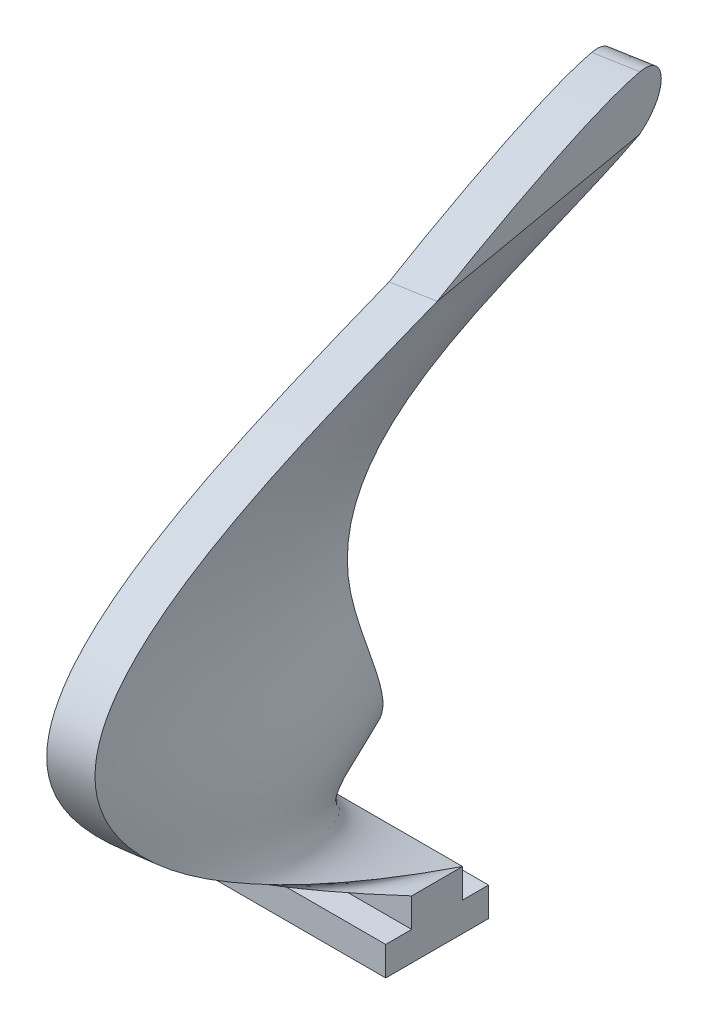
ISO-10303-21;
HEADER;
FILE_DESCRIPTION(('STEP AP214'),'2;1');
FILE_NAME('part.step','',(''),(''),'','','');
FILE_SCHEMA(('AUTOMOTIVE_DESIGN { 1 0 10303 214 1 1 1 1 }'));
ENDSEC;
DATA;
#1=APPLICATION_CONTEXT('core data for automotive mechanical design processes');
#2=APPLICATION_PROTOCOL_DEFINITION('international standard','automotive_design',2000,#1);
#3=PRODUCT_CONTEXT('',#1,'mechanical');
#4=PRODUCT('Part','Part','',(#3));
#5=PRODUCT_RELATED_PRODUCT_CATEGORY('part','',(#4));
#6=PRODUCT_DEFINITION_FORMATION('','',#4);
#7=PRODUCT_DEFINITION_CONTEXT('part definition',#1,'design');
#8=PRODUCT_DEFINITION('design','',#6,#7);
#9=PRODUCT_DEFINITION_SHAPE('','',#8);
#10=(LENGTH_UNIT() NAMED_UNIT(*) SI_UNIT(.MILLI.,.METRE.));
#11=(NAMED_UNIT(*) PLANE_ANGLE_UNIT() SI_UNIT($,.RADIAN.));
#12=(NAMED_UNIT(*) SI_UNIT($,.STERADIAN.) SOLID_ANGLE_UNIT());
#13=UNCERTAINTY_MEASURE_WITH_UNIT(LENGTH_MEASURE(1.E-05),#10,'distance_accuracy_value','');
#14=(GEOMETRIC_REPRESENTATION_CONTEXT(3) GLOBAL_UNCERTAINTY_ASSIGNED_CONTEXT((#13)) GLOBAL_UNIT_ASSIGNED_CONTEXT((#10,
#11,#12)) REPRESENTATION_CONTEXT('',''));
#15=CARTESIAN_POINT('',(0.,0.,0.));
#16=DIRECTION('',(0.,0.,1.));
#17=DIRECTION('',(1.,0.,0.));
#18=AXIS2_PLACEMENT_3D('',#15,#16,#17);
#19=CARTESIAN_POINT('',(10.,2.79856411953538,2.45));
#20=DIRECTION('',(0.,0.,-1.));
#21=DIRECTION('',(0.,1.,0.));
#22=AXIS2_PLACEMENT_3D('',#19,#20,#21);
#23=PLANE('',#22);
#24=DIRECTION('',(0.,-1.,0.));
#25=VECTOR('',#24,1.);
#26=CARTESIAN_POINT('',(-10.,2.79856411953538,2.45));
#27=LINE('',#26,#25);
#28=CARTESIAN_POINT('',(-10.,2.79856411953538,2.45));
#29=VERTEX_POINT('',#28);
#30=CARTESIAN_POINT('',(-10.,0.,2.45));
#31=VERTEX_POINT('',#30);
#32=EDGE_CURVE('E88',#29,#31,#27,.T.);
#33=ORIENTED_EDGE('',*,*,#32,.T.);
#34=DIRECTION('',(-1.,0.,0.));
#35=VECTOR('',#34,1.);
#36=CARTESIAN_POINT('',(10.,0.,2.45));
#37=LINE('',#36,#35);
#38=CARTESIAN_POINT('',(10.,0.,2.45));
#39=VERTEX_POINT('',#38);
#40=EDGE_CURVE('E12',#39,#31,#37,.T.);
#41=ORIENTED_EDGE('',*,*,#40,.F.);
#42=DIRECTION('',(0.,-1.,0.));
#43=VECTOR('',#42,1.);
#44=CARTESIAN_POINT('',(10.,2.79856411953538,2.45));
#45=LINE('',#44,#43);
#46=CARTESIAN_POINT('',(10.,2.79856411953538,2.45));
#47=VERTEX_POINT('',#46);
#48=EDGE_CURVE('E101',#47,#39,#45,.T.);
#49=ORIENTED_EDGE('',*,*,#48,.F.);
#50=DIRECTION('',(1.,0.,0.));
#51=VECTOR('',#50,1.);
#52=CARTESIAN_POINT('',(10.,2.79856411953538,2.45));
#53=LINE('',#52,#51);
#54=EDGE_CURVE('E75',#47,#29,#53,.F.);
#55=ORIENTED_EDGE('',*,*,#54,.T.);
#56=EDGE_LOOP('',(#33,#41,#49,#55));
#57=FACE_BOUND('',#56,.T.);
#58=ADVANCED_FACE('F43',(#57),#23,.F.);
#59=CARTESIAN_POINT('',(10.,2.79856411953538,-2.45));
#60=DIRECTION('',(0.,0.,1.));
#61=DIRECTION('',(0.,-1.,0.));
#62=AXIS2_PLACEMENT_3D('',#59,#60,#61);
#63=PLANE('',#62);
#64=DIRECTION('',(0.,1.,0.));
#65=VECTOR('',#64,1.);
#66=CARTESIAN_POINT('',(-10.,2.79856411953538,-2.45));
#67=LINE('',#66,#65);
#68=CARTESIAN_POINT('',(-10.,0.,-2.45));
#69=VERTEX_POINT('',#68);
#70=CARTESIAN_POINT('',(-10.,2.79856411953538,-2.45));
#71=VERTEX_POINT('',#70);
#72=EDGE_CURVE('E146',#69,#71,#67,.T.);
#73=ORIENTED_EDGE('',*,*,#72,.T.);
#74=DIRECTION('',(1.,0.,0.));
#75=VECTOR('',#74,1.);
#76=CARTESIAN_POINT('',(10.,2.79856411953538,-2.45));
#77=LINE('',#76,#75);
#78=CARTESIAN_POINT('',(10.,2.79856411953538,-2.45));
#79=VERTEX_POINT('',#78);
#80=EDGE_CURVE('E99',#79,#71,#77,.F.);
#81=ORIENTED_EDGE('',*,*,#80,.F.);
#82=DIRECTION('',(0.,1.,0.));
#83=VECTOR('',#82,1.);
#84=CARTESIAN_POINT('',(10.,2.79856411953538,-2.45));
#85=LINE('',#84,#83);
#86=CARTESIAN_POINT('',(10.,0.,-2.45));
#87=VERTEX_POINT('',#86);
#88=EDGE_CURVE('E96',#87,#79,#85,.T.);
#89=ORIENTED_EDGE('',*,*,#88,.F.);
#90=DIRECTION('',(-1.,0.,0.));
#91=VECTOR('',#90,1.);
#92=CARTESIAN_POINT('',(10.,0.,-2.45));
#93=LINE('',#92,#91);
#94=EDGE_CURVE('E53',#87,#69,#93,.T.);
#95=ORIENTED_EDGE('',*,*,#94,.T.);
#96=EDGE_LOOP('',(#73,#81,#89,#95));
#97=FACE_BOUND('',#96,.T.);
#98=ADVANCED_FACE('F97',(#97),#63,.F.);
#99=CARTESIAN_POINT('',(10.,0.,0.));
#100=DIRECTION('',(1.,0.,0.));
#101=DIRECTION('',(0.,0.,-1.));
#102=AXIS2_PLACEMENT_3D('',#99,#100,#101);
#103=PLANE('',#102);
#104=ORIENTED_EDGE('',*,*,#48,.T.);
#105=DIRECTION('',(0.,0.,1.));
#106=VECTOR('',#105,1.);
#107=CARTESIAN_POINT('',(10.,0.,4.95));
#108=LINE('',#107,#106);
#109=CARTESIAN_POINT('',(10.,0.,4.95));
#110=VERTEX_POINT('',#109);
#111=EDGE_CURVE('E119',#39,#110,#108,.T.);
#112=ORIENTED_EDGE('',*,*,#111,.T.);
#113=DIRECTION('',(0.,-1.,0.));
#114=VECTOR('',#113,1.);
#115=CARTESIAN_POINT('',(10.,0.,4.95));
#116=LINE('',#115,#114);
#117=CARTESIAN_POINT('',(10.,-2.8,4.95));
#118=VERTEX_POINT('',#117);
#119=EDGE_CURVE('E137',#110,#118,#116,.T.);
#120=ORIENTED_EDGE('',*,*,#119,.T.);
#121=DIRECTION('',(0.,0.,-1.));
#122=VECTOR('',#121,1.);
#123=CARTESIAN_POINT('',(10.,-2.8,4.95));
#124=LINE('',#123,#122);
#125=CARTESIAN_POINT('',(10.,-2.8,-4.95));
#126=VERTEX_POINT('',#125);
#127=EDGE_CURVE('E442',#118,#126,#124,.T.);
#128=ORIENTED_EDGE('',*,*,#127,.T.);
#129=DIRECTION('',(0.,1.,0.));
#130=VECTOR('',#129,1.);
#131=CARTESIAN_POINT('',(10.,0.,-4.95));
#132=LINE('',#131,#130);
#133=CARTESIAN_POINT('',(10.,0.,-4.95));
#134=VERTEX_POINT('',#133);
#135=EDGE_CURVE('E116',#126,#134,#132,.T.);
#136=ORIENTED_EDGE('',*,*,#135,.T.);
#137=EDGE_CURVE('E108',#134,#87,#108,.T.);
#138=ORIENTED_EDGE('',*,*,#137,.T.);
#139=ORIENTED_EDGE('',*,*,#88,.T.);
#140=DIRECTION('',(0.,0.,-1.));
#141=VECTOR('',#140,1.);
#142=CARTESIAN_POINT('',(10.,2.79856411953538,0.));
#143=LINE('',#142,#141);
#144=EDGE_CURVE('E62',#79,#47,#143,.F.);
#145=ORIENTED_EDGE('',*,*,#144,.T.);
#146=EDGE_LOOP('',(#104,#112,#120,#128,#136,#138,#139,#145));
#147=FACE_BOUND('',#146,.T.);
#148=ADVANCED_FACE('F113',(#147),#103,.T.);
#149=CARTESIAN_POINT('',(-10.,0.,0.));
#150=DIRECTION('',(1.,0.,0.));
#151=DIRECTION('',(0.,0.,-1.));
#152=AXIS2_PLACEMENT_3D('',#149,#150,#151);
#153=PLANE('',#152);
#154=ORIENTED_EDGE('',*,*,#32,.F.);
#155=DIRECTION('',(0.,0.,-1.));
#156=VECTOR('',#155,1.);
#157=CARTESIAN_POINT('',(-10.,2.79856411953538,0.));
#158=LINE('',#157,#156);
#159=EDGE_CURVE('E147',#71,#29,#158,.F.);
#160=ORIENTED_EDGE('',*,*,#159,.F.);
#161=ORIENTED_EDGE('',*,*,#72,.F.);
#162=DIRECTION('',(0.,0.,1.));
#163=VECTOR('',#162,1.);
#164=CARTESIAN_POINT('',(-10.,0.,4.95));
#165=LINE('',#164,#163);
#166=CARTESIAN_POINT('',(-10.,0.,-4.95));
#167=VERTEX_POINT('',#166);
#168=EDGE_CURVE('E110',#167,#69,#165,.T.);
#169=ORIENTED_EDGE('',*,*,#168,.F.);
#170=DIRECTION('',(0.,1.,0.));
#171=VECTOR('',#170,1.);
#172=CARTESIAN_POINT('',(-10.,0.,-4.95));
#173=LINE('',#172,#171);
#174=CARTESIAN_POINT('',(-10.,-2.8,-4.95));
#175=VERTEX_POINT('',#174);
#176=EDGE_CURVE('E133',#175,#167,#173,.T.);
#177=ORIENTED_EDGE('',*,*,#176,.F.);
#178=DIRECTION('',(0.,0.,-1.));
#179=VECTOR('',#178,1.);
#180=CARTESIAN_POINT('',(-10.,-2.8,4.95));
#181=LINE('',#180,#179);
#182=CARTESIAN_POINT('',(-10.,-2.8,4.95));
#183=VERTEX_POINT('',#182);
#184=EDGE_CURVE('E130',#183,#175,#181,.T.);
#185=ORIENTED_EDGE('',*,*,#184,.F.);
#186=DIRECTION('',(0.,-1.,0.));
#187=VECTOR('',#186,1.);
#188=CARTESIAN_POINT('',(-10.,0.,4.95));
#189=LINE('',#188,#187);
#190=CARTESIAN_POINT('',(-10.,0.,4.95));
#191=VERTEX_POINT('',#190);
#192=EDGE_CURVE('E127',#191,#183,#189,.T.);
#193=ORIENTED_EDGE('',*,*,#192,.F.);
#194=EDGE_CURVE('E136',#31,#191,#165,.T.);
#195=ORIENTED_EDGE('',*,*,#194,.F.);
#196=EDGE_LOOP('',(#154,#160,#161,#169,#177,#185,#193,#195));
#197=FACE_BOUND('',#196,.T.);
#198=ADVANCED_FACE('F399',(#197),#153,.F.);
#199=CARTESIAN_POINT('',(10.,0.,4.95));
#200=DIRECTION('',(0.,-1.,0.));
#201=DIRECTION('',(0.,0.,-1.));
#202=AXIS2_PLACEMENT_3D('',#199,#200,#201);
#203=PLANE('',#202);
#204=ORIENTED_EDGE('',*,*,#111,.F.);
#205=ORIENTED_EDGE('',*,*,#40,.T.);
#206=ORIENTED_EDGE('',*,*,#194,.T.);
#207=DIRECTION('',(-1.,0.,0.));
#208=VECTOR('',#207,1.);
#209=CARTESIAN_POINT('',(10.,0.,4.95));
#210=LINE('',#209,#208);
#211=EDGE_CURVE('E118',#110,#191,#210,.T.);
#212=ORIENTED_EDGE('',*,*,#211,.F.);
#213=EDGE_LOOP('',(#204,#205,#206,#212));
#214=FACE_BOUND('',#213,.T.);
#215=ADVANCED_FACE('F391',(#214),#203,.F.);
#216=CARTESIAN_POINT('',(10.,0.,4.95));
#217=DIRECTION('',(0.,0.,-1.));
#218=DIRECTION('',(0.,1.,0.));
#219=AXIS2_PLACEMENT_3D('',#216,#217,#218);
#220=PLANE('',#219);
#221=ORIENTED_EDGE('',*,*,#192,.T.);
#222=DIRECTION('',(-1.,0.,0.));
#223=VECTOR('',#222,1.);
#224=CARTESIAN_POINT('',(10.,-2.8,4.95));
#225=LINE('',#224,#223);
#226=EDGE_CURVE('E143',#118,#183,#225,.T.);
#227=ORIENTED_EDGE('',*,*,#226,.F.);
#228=ORIENTED_EDGE('',*,*,#119,.F.);
#229=ORIENTED_EDGE('',*,*,#211,.T.);
#230=EDGE_LOOP('',(#221,#227,#228,#229));
#231=FACE_BOUND('',#230,.T.);
#232=ADVANCED_FACE('F405',(#231),#220,.F.);
#233=CARTESIAN_POINT('',(10.,-2.8,4.95));
#234=DIRECTION('',(0.,1.,0.));
#235=DIRECTION('',(0.,0.,1.));
#236=AXIS2_PLACEMENT_3D('',#233,#234,#235);
#237=PLANE('',#236);
#238=ORIENTED_EDGE('',*,*,#184,.T.);
#239=DIRECTION('',(-1.,0.,0.));
#240=VECTOR('',#239,1.);
#241=CARTESIAN_POINT('',(10.,-2.8,-4.95));
#242=LINE('',#241,#240);
#243=EDGE_CURVE('E140',#126,#175,#242,.T.);
#244=ORIENTED_EDGE('',*,*,#243,.F.);
#245=ORIENTED_EDGE('',*,*,#127,.F.);
#246=ORIENTED_EDGE('',*,*,#226,.T.);
#247=EDGE_LOOP('',(#238,#244,#245,#246));
#248=FACE_BOUND('',#247,.T.);
#249=ADVANCED_FACE('F408',(#248),#237,.F.);
#250=CARTESIAN_POINT('',(10.,0.,-4.95));
#251=DIRECTION('',(0.,0.,1.));
#252=DIRECTION('',(0.,-1.,0.));
#253=AXIS2_PLACEMENT_3D('',#250,#251,#252);
#254=PLANE('',#253);
#255=ORIENTED_EDGE('',*,*,#176,.T.);
#256=DIRECTION('',(-1.,0.,0.));
#257=VECTOR('',#256,1.);
#258=CARTESIAN_POINT('',(10.,0.,-4.95));
#259=LINE('',#258,#257);
#260=EDGE_CURVE('E122',#134,#167,#259,.T.);
#261=ORIENTED_EDGE('',*,*,#260,.F.);
#262=ORIENTED_EDGE('',*,*,#135,.F.);
#263=ORIENTED_EDGE('',*,*,#243,.T.);
#264=EDGE_LOOP('',(#255,#261,#262,#263));
#265=FACE_BOUND('',#264,.T.);
#266=ADVANCED_FACE('F390',(#265),#254,.F.);
#267=ORIENTED_EDGE('',*,*,#94,.F.);
#268=ORIENTED_EDGE('',*,*,#137,.F.);
#269=ORIENTED_EDGE('',*,*,#260,.T.);
#270=ORIENTED_EDGE('',*,*,#168,.T.);
#271=EDGE_LOOP('',(#267,#268,#269,#270));
#272=FACE_BOUND('',#271,.T.);
#273=ADVANCED_FACE('F106',(#272),#203,.F.);
#274=CARTESIAN_POINT('',(10.,2.79856411953538,-2.45));
#275=CARTESIAN_POINT('',(7.82884164371637,4.1239699270205,5.6409345672917));
#276=CARTESIAN_POINT('',(4.18148074152889,8.36207144029354,19.5904089110549));
#277=CARTESIAN_POINT('',(5.37264512660147,30.603270064028,36.7876880456451));
#278=CARTESIAN_POINT('',(2.63593618777064,38.1906459430577,6.68844059463243));
#279=CARTESIAN_POINT('',(1.65339363802755,42.7985641195354,-8.35070503463243));
#280=CARTESIAN_POINT('',(3.33333333333333,2.79856411953538,-2.45));
#281=CARTESIAN_POINT('',(3.66063205225054,4.27186432247661,2.58406787890734));
#282=CARTESIAN_POINT('',(6.16807609698479,8.30839004291202,10.8188863738585));
#283=CARTESIAN_POINT('',(3.89274866806912,30.6865675487003,25.1847265148831));
#284=CARTESIAN_POINT('',(1.04944085888998,37.8604779794918,-2.21407646881696));
#285=CARTESIAN_POINT('',(0.264208216692132,42.7985641195354,-16.2291670587301));
#286=CARTESIAN_POINT('',(-3.33333333333333,2.79856411953538,-2.45));
#287=CARTESIAN_POINT('',(-0.507577539215303,4.41975871793272,-0.472798809477014));
#288=CARTESIAN_POINT('',(5.8024061078947,8.25470864553051,2.46213168269114));
#289=CARTESIAN_POINT('',(0.86653506884201,30.7698650333725,13.8544224167575));
#290=CARTESIAN_POINT('',(-0.537054469990673,37.5303100159258,-11.1165935322664));
#291=CARTESIAN_POINT('',(-1.12497720464329,42.7985641195354,-24.1076290828278));
#292=CARTESIAN_POINT('',(-10.,2.79856411953538,-2.45));
#293=CARTESIAN_POINT('',(-4.67578713068114,4.56765311338883,-3.52966549786137));
#294=CARTESIAN_POINT('',(3.08447077425863,8.20102724814901,-5.47985516244728));
#295=CARTESIAN_POINT('',(-3.70599567107987,30.8531625180448,2.79677575126846));
#296=CARTESIAN_POINT('',(-2.12354979887133,37.2001420523599,-20.0191105957157));
#297=CARTESIAN_POINT('',(-2.51416262597871,42.7985641195354,-31.9860911069254));
#298=B_SPLINE_SURFACE_WITH_KNOTS('',3,3,((#274,#275,#276,#277,#278,#279),(#280,#281,#282,#283,
#284,#285),(#286,#287,#288,#289,#290,#291),(#292,#293,#294,#295,#296,#297)),.UNSPECIFIED.,.F.,
.F.,.F.,(4,4),(4,1,1,4),(0.,1.),(0.,0.241419323946745,0.410683841132289,1.),.UNSPECIFIED.);
#299=CARTESIAN_POINT('',(-10.,2.79856411953538,-2.45));
#300=CARTESIAN_POINT('',(-4.67578713068114,4.56765311338883,-3.52966549786137));
#301=CARTESIAN_POINT('',(3.08447077425863,8.20102724814901,-5.47985516244728));
#302=CARTESIAN_POINT('',(-3.70599567107987,30.8531625180448,2.79677575126846));
#303=CARTESIAN_POINT('',(-2.12354979887133,37.2001420523599,-20.0191105957157));
#304=CARTESIAN_POINT('',(-2.51416262597871,42.7985641195354,-31.9860911069254));
#305=B_SPLINE_CURVE_WITH_KNOTS('',3,(#299,#300,#301,#302,#303,#304),.UNSPECIFIED.,.F.,.F.,(4,1,
1,4),(0.,0.241419323946745,0.410683841132289,1.),.UNSPECIFIED.);
#306=CARTESIAN_POINT('',(-2.51416262597871,42.7985641195354,-31.9860911069254));
#307=VERTEX_POINT('',#306);
#308=EDGE_CURVE('E268',#71,#307,#305,.T.);
#309=DIRECTION('',(-0.173648177666928,0.,-0.984807753012208));
#310=VECTOR('',#309,1.);
#311=CARTESIAN_POINT('',(-2.51416262597871,42.7985641195354,-31.9860911069254));
#312=LINE('',#311,#310);
#313=CARTESIAN_POINT('',(1.65339363802755,42.7985641195354,-8.35070503463242));
#314=VERTEX_POINT('',#313);
#315=EDGE_CURVE('E216',#314,#307,#312,.T.);
#316=CARTESIAN_POINT('',(10.,2.79856411953538,-2.45));
#317=CARTESIAN_POINT('',(7.82884164371637,4.1239699270205,5.6409345672917));
#318=CARTESIAN_POINT('',(4.18148074152889,8.36207144029354,19.5904089110549));
#319=CARTESIAN_POINT('',(5.37264512660147,30.603270064028,36.7876880456451));
#320=CARTESIAN_POINT('',(2.63593618777064,38.1906459430577,6.68844059463243));
#321=CARTESIAN_POINT('',(1.65339363802755,42.7985641195354,-8.35070503463243));
#322=B_SPLINE_CURVE_WITH_KNOTS('',3,(#316,#317,#318,#319,#320,#321),.UNSPECIFIED.,.F.,.F.,(4,1,
1,4),(0.,0.241419323946745,0.410683841132289,1.),.UNSPECIFIED.);
#323=EDGE_CURVE('E267',#314,#79,#322,.F.);
#324=ORIENTED_EDGE('',*,*,#80,.T.);
#325=ORIENTED_EDGE('',*,*,#308,.T.);
#326=ORIENTED_EDGE('',*,*,#315,.F.);
#327=ORIENTED_EDGE('',*,*,#323,.T.);
#328=EDGE_LOOP('',(#324,#325,#326,#327));
#329=FACE_BOUND('',#328,.T.);
#330=ADVANCED_FACE('F371',(#329),#298,.T.);
#331=CARTESIAN_POINT('',(-10.,2.79856411953538,-2.45));
#332=CARTESIAN_POINT('',(-4.67578713068114,4.56765311338883,-3.52966549786137));
#333=CARTESIAN_POINT('',(3.08447077425863,8.20102724814901,-5.47985516244728));
#334=CARTESIAN_POINT('',(-3.70599567107987,30.8531625180448,2.79677575126846));
#335=CARTESIAN_POINT('',(-2.12354979887133,37.2001420523599,-20.0191105957157));
#336=CARTESIAN_POINT('',(-2.51416262597871,42.7985641195354,-31.9860911069254));
#337=CARTESIAN_POINT('',(-10.,2.79856411953538,-0.816666666666666));
#338=CARTESIAN_POINT('',(-5.26554212451828,4.65086780414337,-2.57124619651446));
#339=CARTESIAN_POINT('',(1.55050616116835,8.17561519954281,-5.47030096911469));
#340=CARTESIAN_POINT('',(-4.81369378285122,30.8767903639629,3.23469818145168));
#341=CARTESIAN_POINT('',(-3.43662680288761,37.2001420523599,-19.7875796921598));
#342=CARTESIAN_POINT('',(-3.82723962999499,42.7985641195354,-31.7545602033695));
#343=CARTESIAN_POINT('',(-10.,2.79856411953538,0.816666666666667));
#344=CARTESIAN_POINT('',(-5.85529711835543,4.73408249489792,-1.61282689516755));
#345=CARTESIAN_POINT('',(0.0165415480780787,8.15020315093662,-5.46074677578209));
#346=CARTESIAN_POINT('',(-5.92139189462258,30.9004182098809,3.6726206116349));
#347=CARTESIAN_POINT('',(-4.74970380690389,37.2001420523599,-19.5560487886039));
#348=CARTESIAN_POINT('',(-5.14031663401126,42.7985641195354,-31.5230292998136));
#349=CARTESIAN_POINT('',(-10.,2.79856411953538,2.45));
#350=CARTESIAN_POINT('',(-6.44505211219258,4.81729718565246,-0.654407593820641));
#351=CARTESIAN_POINT('',(-1.5174230650122,8.12479110233042,-5.4511925824495));
#352=CARTESIAN_POINT('',(-7.02909000639393,30.924046055799,4.11054304181812));
#353=CARTESIAN_POINT('',(-6.06278081092016,37.2001420523599,-19.324517885048));
#354=CARTESIAN_POINT('',(-6.45339363802754,42.7985641195354,-31.2914983962577));
#355=B_SPLINE_SURFACE_WITH_KNOTS('',3,3,((#331,#332,#333,#334,#335,#336),(#337,#338,#339,#340,
#341,#342),(#343,#344,#345,#346,#347,#348),(#349,#350,#351,#352,#353,#354)),.UNSPECIFIED.,.F.,
.F.,.F.,(4,4),(4,1,1,4),(0.,1.),(0.,0.241419323946745,0.410683841132289,1.),.UNSPECIFIED.);
#356=CARTESIAN_POINT('',(-10.,2.79856411953538,2.45));
#357=CARTESIAN_POINT('',(-6.44505211219258,4.81729718565246,-0.654407593820641));
#358=CARTESIAN_POINT('',(-1.5174230650122,8.12479110233042,-5.4511925824495));
#359=CARTESIAN_POINT('',(-7.02909000639393,30.924046055799,4.11054304181812));
#360=CARTESIAN_POINT('',(-6.06278081092016,37.2001420523599,-19.324517885048));
#361=CARTESIAN_POINT('',(-6.45339363802754,42.7985641195354,-31.2914983962577));
#362=B_SPLINE_CURVE_WITH_KNOTS('',3,(#356,#357,#358,#359,#360,#361),.UNSPECIFIED.,.F.,.F.,(4,1,
1,4),(0.,0.241419323946745,0.410683841132289,1.),.UNSPECIFIED.);
#363=CARTESIAN_POINT('',(-6.45339363802754,42.7985641195354,-31.2914983962577));
#364=VERTEX_POINT('',#363);
#365=EDGE_CURVE('E269',#29,#364,#362,.T.);
#366=DIRECTION('',(-0.984807753012208,0.,0.173648177666928));
#367=VECTOR('',#366,1.);
#368=CARTESIAN_POINT('',(-6.45339363802754,42.7985641195354,-31.2914983962577));
#369=LINE('',#368,#367);
#370=EDGE_CURVE('E220',#307,#364,#369,.T.);
#371=ORIENTED_EDGE('',*,*,#159,.T.);
#372=ORIENTED_EDGE('',*,*,#365,.T.);
#373=ORIENTED_EDGE('',*,*,#370,.F.);
#374=ORIENTED_EDGE('',*,*,#308,.F.);
#375=EDGE_LOOP('',(#371,#372,#373,#374));
#376=FACE_BOUND('',#375,.T.);
#377=ADVANCED_FACE('F325',(#376),#355,.T.);
#378=CARTESIAN_POINT('',(10.,2.79856411953538,2.45));
#379=CARTESIAN_POINT('',(6.00193501471665,4.2755348158669,8.88978455179783));
#380=CARTESIAN_POINT('',(-0.402810528599014,8.31578665226592,19.5049841824105));
#381=CARTESIAN_POINT('',(2.0331841142864,30.646305155642,38.2075324727365));
#382=CARTESIAN_POINT('',(-1.30329482427819,38.1906459430577,7.38303330530015));
#383=CARTESIAN_POINT('',(-2.28583737402128,42.7985641195354,-7.65611232396471));
#384=CARTESIAN_POINT('',(10.,2.79856411953538,0.816666666666667));
#385=CARTESIAN_POINT('',(6.61090389104989,4.22501318625144,7.80683455696245));
#386=CARTESIAN_POINT('',(1.12528656144362,8.33121491494179,19.5334590919586));
#387=CARTESIAN_POINT('',(3.14633778505809,30.631960125104,37.7342509970394));
#388=CARTESIAN_POINT('',(0.00978217973808476,38.1906459430577,7.15150240174424));
#389=CARTESIAN_POINT('',(-0.972760370005002,42.7985641195354,-7.88764322752061));
#390=CARTESIAN_POINT('',(10.,2.79856411953538,-0.816666666666666));
#391=CARTESIAN_POINT('',(7.21987276738313,4.17449155663597,6.72388456212708));
#392=CARTESIAN_POINT('',(2.65338365148625,8.34664317761766,19.5619340015067));
#393=CARTESIAN_POINT('',(4.25949145582978,30.617615094566,37.2609695213422));
#394=CARTESIAN_POINT('',(1.32285918375436,38.1906459430577,6.91997149818834));
#395=CARTESIAN_POINT('',(0.340316634011276,42.7985641195354,-8.11917413107652));
#396=CARTESIAN_POINT('',(10.,2.79856411953538,-2.45));
#397=CARTESIAN_POINT('',(7.82884164371637,4.1239699270205,5.6409345672917));
#398=CARTESIAN_POINT('',(4.18148074152888,8.36207144029354,19.5904089110549));
#399=CARTESIAN_POINT('',(5.37264512660147,30.603270064028,36.7876880456451));
#400=CARTESIAN_POINT('',(2.63593618777064,38.1906459430577,6.68844059463243));
#401=CARTESIAN_POINT('',(1.65339363802755,42.7985641195354,-8.35070503463242));
#402=B_SPLINE_SURFACE_WITH_KNOTS('',3,3,((#378,#379,#380,#381,#382,#383),(#384,#385,#386,#387,
#388,#389),(#390,#391,#392,#393,#394,#395),(#396,#397,#398,#399,#400,#401)),.UNSPECIFIED.,.F.,
.F.,.F.,(4,4),(4,1,1,4),(0.,1.),(0.,0.241419323946745,0.410683841132289,1.),.UNSPECIFIED.);
#403=DIRECTION('',(0.984807753012208,0.,-0.173648177666928));
#404=VECTOR('',#403,1.);
#405=CARTESIAN_POINT('',(1.65339363802755,42.7985641195354,-8.35070503463242));
#406=LINE('',#405,#404);
#407=CARTESIAN_POINT('',(-2.28583737402128,42.7985641195354,-7.65611232396471));
#408=VERTEX_POINT('',#407);
#409=EDGE_CURVE('E46',#408,#314,#406,.T.);
#410=CARTESIAN_POINT('',(10.,2.79856411953538,2.45));
#411=CARTESIAN_POINT('',(6.00193501471665,4.2755348158669,8.88978455179783));
#412=CARTESIAN_POINT('',(-0.402810528599015,8.31578665226592,19.5049841824105));
#413=CARTESIAN_POINT('',(2.03318411428641,30.646305155642,38.2075324727366));
#414=CARTESIAN_POINT('',(-1.30329482427819,38.1906459430577,7.38303330530016));
#415=CARTESIAN_POINT('',(-2.28583737402128,42.7985641195354,-7.65611232396471));
#416=B_SPLINE_CURVE_WITH_KNOTS('',3,(#410,#411,#412,#413,#414,#415),.UNSPECIFIED.,.F.,.F.,(4,1,
1,4),(0.,0.241419323946745,0.410683841132289,1.),.UNSPECIFIED.);
#417=EDGE_CURVE('E288',#47,#408,#416,.T.);
#418=ORIENTED_EDGE('',*,*,#144,.F.);
#419=ORIENTED_EDGE('',*,*,#323,.F.);
#420=ORIENTED_EDGE('',*,*,#409,.F.);
#421=ORIENTED_EDGE('',*,*,#417,.F.);
#422=EDGE_LOOP('',(#418,#419,#420,#421));
#423=FACE_BOUND('',#422,.T.);
#424=ADVANCED_FACE('F312',(#423),#402,.T.);
#425=CARTESIAN_POINT('',(-10.,2.79856411953538,2.45));
#426=CARTESIAN_POINT('',(-6.44505211219258,4.81729718565246,-0.654407593820641));
#427=CARTESIAN_POINT('',(-1.5174230650122,8.12479110233042,-5.4511925824495));
#428=CARTESIAN_POINT('',(-7.02909000639393,30.924046055799,4.11054304181812));
#429=CARTESIAN_POINT('',(-6.06278081092016,37.2001420523599,-19.324517885048));
#430=CARTESIAN_POINT('',(-6.45339363802754,42.7985641195354,-31.2914983962577));
#431=CARTESIAN_POINT('',(-3.33333333333333,2.79856411953538,2.45));
#432=CARTESIAN_POINT('',(-2.29605640322283,4.63670972905727,2.52698978805218));
#433=CARTESIAN_POINT('',(0.198266072580381,8.18845628564225,2.63052280810632));
#434=CARTESIAN_POINT('',(-3.12472217148442,30.8314657557467,15.3204019382368));
#435=CARTESIAN_POINT('',(-4.47628548203951,37.5303100159259,-10.4220008215986));
#436=CARTESIAN_POINT('',(-5.06420821669212,42.7985641195354,-23.41303637216));
#437=CARTESIAN_POINT('',(3.33333333333333,2.79856411953538,2.45));
#438=CARTESIAN_POINT('',(1.85293930574691,4.45612227246209,5.70838716992501));
#439=CARTESIAN_POINT('',(0.569803584718107,8.25212146895409,10.949248396393));
#440=CARTESIAN_POINT('',(-0.103964131257643,30.7388854556944,26.6860650818762));
#441=CARTESIAN_POINT('',(-2.88979015315885,37.8604779794918,-1.51948375814923));
#442=CARTESIAN_POINT('',(-3.6750227953567,42.7985641195354,-15.5345743480624));
#443=CARTESIAN_POINT('',(10.,2.79856411953538,2.45));
#444=CARTESIAN_POINT('',(6.00193501471665,4.2755348158669,8.88978455179783));
#445=CARTESIAN_POINT('',(-0.402810528599015,8.31578665226592,19.5049841824105));
#446=CARTESIAN_POINT('',(2.03318411428641,30.646305155642,38.2075324727366));
#447=CARTESIAN_POINT('',(-1.30329482427819,38.1906459430577,7.38303330530016));
#448=CARTESIAN_POINT('',(-2.28583737402128,42.7985641195354,-7.65611232396471));
#449=B_SPLINE_SURFACE_WITH_KNOTS('',3,3,((#425,#426,#427,#428,#429,#430),(#431,#432,#433,#434,
#435,#436),(#437,#438,#439,#440,#441,#442),(#443,#444,#445,#446,#447,#448)),.UNSPECIFIED.,.F.,
.F.,.F.,(4,4),(4,1,1,4),(0.,1.),(0.,0.241419323946745,0.410683841132289,1.),.UNSPECIFIED.);
#450=DIRECTION('',(0.173648177666928,0.,0.984807753012209));
#451=VECTOR('',#450,1.);
#452=CARTESIAN_POINT('',(-2.28583737402128,42.7985641195354,-7.65611232396471));
#453=LINE('',#452,#451);
#454=EDGE_CURVE('E234',#364,#408,#453,.T.);
#455=ORIENTED_EDGE('',*,*,#54,.F.);
#456=ORIENTED_EDGE('',*,*,#417,.T.);
#457=ORIENTED_EDGE('',*,*,#454,.F.);
#458=ORIENTED_EDGE('',*,*,#365,.F.);
#459=EDGE_LOOP('',(#455,#456,#457,#458));
#460=FACE_BOUND('',#459,.T.);
#461=ADVANCED_FACE('F324',(#460),#449,.T.);
#462=CARTESIAN_POINT('',(-6.46438031151466,48.,-31.3538069178632));
#463=CARTESIAN_POINT('',(-7.01364627699248,48.,-34.4688490020124));
#464=CARTESIAN_POINT('',(-7.09221649867814,44.5361545289534,-34.9144428718216));
#465=CARTESIAN_POINT('',(-6.45339363802755,42.7985641195354,-31.2914983962577));
#466=B_SPLINE_CURVE_WITH_KNOTS('',3,(#462,#463,#464,#465),.UNSPECIFIED.,.F.,.F.,(4,4),(0.,1.),.UNSPECIFIED.);
#467=DIRECTION('',(0.984807753012208,0.,-0.173648177666928));
#468=VECTOR('',#467,1.);
#469=SURFACE_OF_LINEAR_EXTRUSION('',#466,#468);
#470=CARTESIAN_POINT('',(-2.52514929946582,48.,-32.0483996285309));
#471=CARTESIAN_POINT('',(-3.07441526494364,48.,-35.1634417126801));
#472=CARTESIAN_POINT('',(-3.1529854866293,44.5361545289534,-35.6090355824893));
#473=CARTESIAN_POINT('',(-2.51416262597871,42.7985641195354,-31.9860911069254));
#474=B_SPLINE_CURVE_WITH_KNOTS('',3,(#470,#471,#472,#473),.UNSPECIFIED.,.F.,.F.,(4,4),(0.,1.),.UNSPECIFIED.);
#475=CARTESIAN_POINT('',(-2.52514929946582,48.,-32.0483996285309));
#476=VERTEX_POINT('',#475);
#477=EDGE_CURVE('E215',#476,#307,#474,.T.);
#478=ORIENTED_EDGE('',*,*,#477,.T.);
#479=ORIENTED_EDGE('',*,*,#370,.T.);
#480=CARTESIAN_POINT('',(-6.46438031151466,48.,-31.3538069178632));
#481=VERTEX_POINT('',#480);
#482=EDGE_CURVE('E161',#481,#364,#466,.T.);
#483=ORIENTED_EDGE('',*,*,#482,.F.);
#484=DIRECTION('',(0.984807753012208,0.,-0.173648177666928));
#485=VECTOR('',#484,1.);
#486=CARTESIAN_POINT('',(-6.46438031151466,48.,-31.3538069178632));
#487=LINE('',#486,#485);
#488=EDGE_CURVE('E160',#481,#476,#487,.T.);
#489=ORIENTED_EDGE('',*,*,#488,.T.);
#490=EDGE_LOOP('',(#478,#479,#483,#489));
#491=FACE_BOUND('',#490,.T.);
#492=ADVANCED_FACE('F184',(#491),#469,.F.);
#493=CARTESIAN_POINT('',(-2.28583737402128,42.7985641195354,-7.65611232396471));
#494=CARTESIAN_POINT('',(-3.30684829326351,44.6070531552878,-13.4465529878944));
#495=CARTESIAN_POINT('',(-5.48706417524788,48.,-25.8111716822344));
#496=CARTESIAN_POINT('',(-6.46438031151466,48.,-31.3538069178632));
#497=B_SPLINE_CURVE_WITH_KNOTS('',3,(#493,#494,#495,#496),.UNSPECIFIED.,.F.,.F.,(4,4),(0.,1.),.UNSPECIFIED.);
#498=DIRECTION('',(0.984807753012208,0.,-0.173648177666928));
#499=VECTOR('',#498,1.);
#500=SURFACE_OF_LINEAR_EXTRUSION('',#497,#499);
#501=CARTESIAN_POINT('',(1.65339363802755,42.7985641195354,-8.35070503463242));
#502=CARTESIAN_POINT('',(0.63238271878532,44.6070531552878,-14.1411456985622));
#503=CARTESIAN_POINT('',(-1.54783316319904,48.,-26.5057643929021));
#504=CARTESIAN_POINT('',(-2.52514929946582,48.,-32.0483996285309));
#505=B_SPLINE_CURVE_WITH_KNOTS('',3,(#501,#502,#503,#504),.UNSPECIFIED.,.F.,.F.,(4,4),(0.,1.),.UNSPECIFIED.);
#506=EDGE_CURVE('E210',#314,#476,#505,.T.);
#507=ORIENTED_EDGE('',*,*,#506,.T.);
#508=ORIENTED_EDGE('',*,*,#488,.F.);
#509=EDGE_CURVE('E156',#408,#481,#497,.T.);
#510=ORIENTED_EDGE('',*,*,#509,.F.);
#511=ORIENTED_EDGE('',*,*,#409,.T.);
#512=EDGE_LOOP('',(#507,#508,#510,#511));
#513=FACE_BOUND('',#512,.T.);
#514=ADVANCED_FACE('F178',(#513),#500,.F.);
#515=CARTESIAN_POINT('',(-6.90442028456926,46.0508784632994,-33.8493976169529));
#516=DIRECTION('',(-0.984807753012208,0.,0.173648177666928));
#517=DIRECTION('',(0.173648177666928,0.,0.984807753012209));
#518=AXIS2_PLACEMENT_3D('',#515,#516,#517);
#519=PLANE('',#518);
#520=ORIENTED_EDGE('',*,*,#482,.T.);
#521=ORIENTED_EDGE('',*,*,#454,.T.);
#522=ORIENTED_EDGE('',*,*,#509,.T.);
#523=EDGE_LOOP('',(#520,#521,#522));
#524=FACE_BOUND('',#523,.T.);
#525=ADVANCED_FACE('F183',(#524),#519,.T.);
#526=CARTESIAN_POINT('',(-2.96518927252042,46.0508784632994,-34.5439903276206));
#527=DIRECTION('',(-0.984807753012208,0.,0.173648177666928));
#528=DIRECTION('',(0.173648177666928,0.,0.984807753012209));
#529=AXIS2_PLACEMENT_3D('',#526,#527,#528);
#530=PLANE('',#529);
#531=ORIENTED_EDGE('',*,*,#477,.F.);
#532=ORIENTED_EDGE('',*,*,#506,.F.);
#533=ORIENTED_EDGE('',*,*,#315,.T.);
#534=EDGE_LOOP('',(#531,#532,#533));
#535=FACE_BOUND('',#534,.T.);
#536=ADVANCED_FACE('F186',(#535),#530,.F.);
#537=CLOSED_SHELL('',(#58,#98,#148,#198,#215,#232,#249,#266,#273,#330,#377,#424,#461,#492,#514,
#525,#536));
#538=MANIFOLD_SOLID_BREP('B2',#537);
#539=ADVANCED_BREP_SHAPE_REPRESENTATION('',(#18,#538),#14);
#540=SHAPE_DEFINITION_REPRESENTATION(#9,#539);
ENDSEC;
END-ISO-10303-21;
